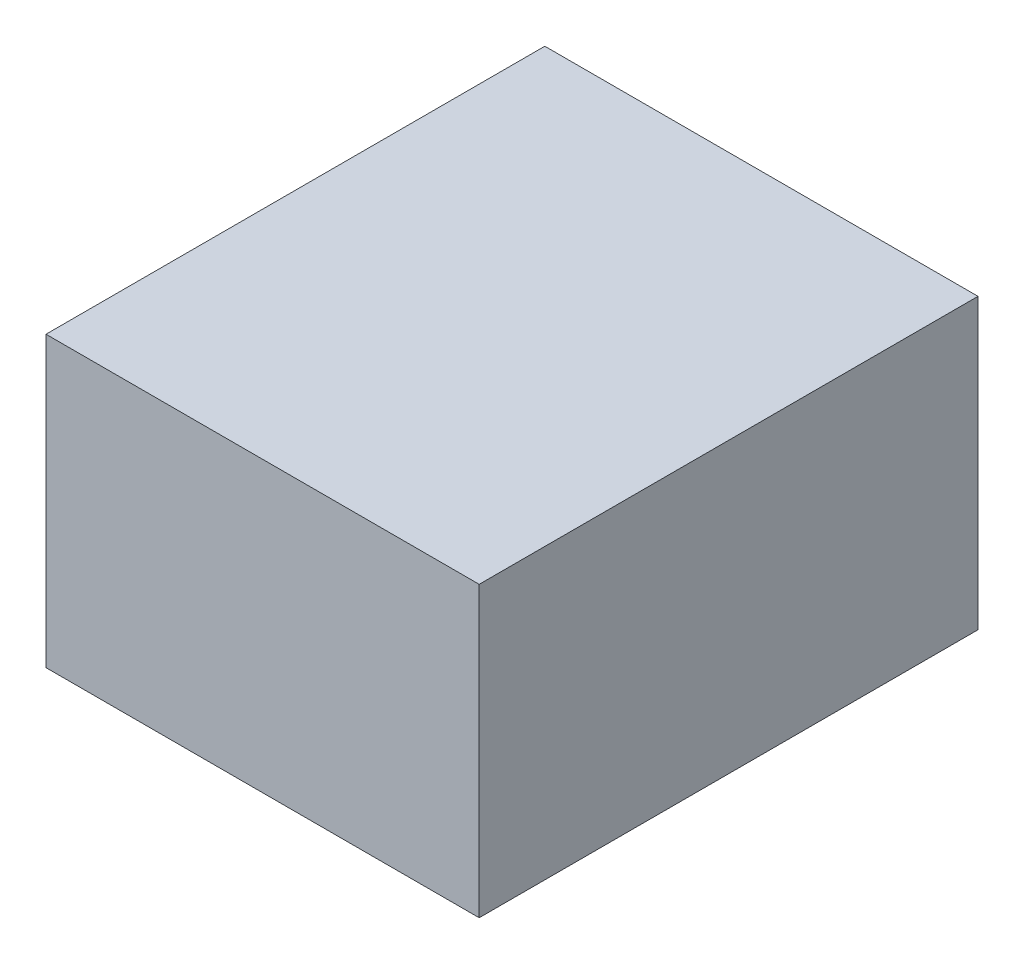
ISO-10303-21;
HEADER;
FILE_DESCRIPTION(('STEP AP214'),'2;1');
FILE_NAME('part.step','',(''),(''),'','','');
FILE_SCHEMA(('AUTOMOTIVE_DESIGN { 1 0 10303 214 1 1 1 1 }'));
ENDSEC;
DATA;
#1=APPLICATION_CONTEXT('core data for automotive mechanical design processes');
#2=APPLICATION_PROTOCOL_DEFINITION('international standard','automotive_design',2000,#1);
#3=PRODUCT_CONTEXT('',#1,'mechanical');
#4=PRODUCT('Part','Part','',(#3));
#5=PRODUCT_RELATED_PRODUCT_CATEGORY('part','',(#4));
#6=PRODUCT_DEFINITION_FORMATION('','',#4);
#7=PRODUCT_DEFINITION_CONTEXT('part definition',#1,'design');
#8=PRODUCT_DEFINITION('design','',#6,#7);
#9=PRODUCT_DEFINITION_SHAPE('','',#8);
#10=(LENGTH_UNIT() NAMED_UNIT(*) SI_UNIT(.MILLI.,.METRE.));
#11=(NAMED_UNIT(*) PLANE_ANGLE_UNIT() SI_UNIT($,.RADIAN.));
#12=(NAMED_UNIT(*) SI_UNIT($,.STERADIAN.) SOLID_ANGLE_UNIT());
#13=UNCERTAINTY_MEASURE_WITH_UNIT(LENGTH_MEASURE(1.E-05),#10,'distance_accuracy_value','');
#14=(GEOMETRIC_REPRESENTATION_CONTEXT(3) GLOBAL_UNCERTAINTY_ASSIGNED_CONTEXT((#13)) GLOBAL_UNIT_ASSIGNED_CONTEXT((#10,
#11,#12)) REPRESENTATION_CONTEXT('',''));
#15=CARTESIAN_POINT('',(0.,0.,0.));
#16=DIRECTION('',(0.,0.,1.));
#17=DIRECTION('',(1.,0.,0.));
#18=AXIS2_PLACEMENT_3D('',#15,#16,#17);
#19=CARTESIAN_POINT('',(209.55,279.4,241.3));
#20=DIRECTION('',(-1.,0.,0.));
#21=DIRECTION('',(0.,0.,1.));
#22=AXIS2_PLACEMENT_3D('',#19,#20,#21);
#23=PLANE('',#22);
#24=DIRECTION('',(0.,0.,-1.));
#25=VECTOR('',#24,1.);
#26=CARTESIAN_POINT('',(209.55,0.,241.3));
#27=LINE('',#26,#25);
#28=CARTESIAN_POINT('',(209.55,0.,241.3));
#29=VERTEX_POINT('',#28);
#30=CARTESIAN_POINT('',(209.55,0.,-241.3));
#31=VERTEX_POINT('',#30);
#32=EDGE_CURVE('E96',#29,#31,#27,.T.);
#33=ORIENTED_EDGE('',*,*,#32,.T.);
#34=DIRECTION('',(0.,-1.,0.));
#35=VECTOR('',#34,1.);
#36=CARTESIAN_POINT('',(209.55,279.4,-241.3));
#37=LINE('',#36,#35);
#38=CARTESIAN_POINT('',(209.55,279.4,-241.3));
#39=VERTEX_POINT('',#38);
#40=EDGE_CURVE('E11',#39,#31,#37,.T.);
#41=ORIENTED_EDGE('',*,*,#40,.F.);
#42=DIRECTION('',(0.,0.,-1.));
#43=VECTOR('',#42,1.);
#44=CARTESIAN_POINT('',(209.55,279.4,241.3));
#45=LINE('',#44,#43);
#46=CARTESIAN_POINT('',(209.55,279.4,241.3));
#47=VERTEX_POINT('',#46);
#48=EDGE_CURVE('E84',#47,#39,#45,.T.);
#49=ORIENTED_EDGE('',*,*,#48,.F.);
#50=DIRECTION('',(0.,-1.,0.));
#51=VECTOR('',#50,1.);
#52=CARTESIAN_POINT('',(209.55,279.4,241.3));
#53=LINE('',#52,#51);
#54=EDGE_CURVE('E92',#47,#29,#53,.T.);
#55=ORIENTED_EDGE('',*,*,#54,.T.);
#56=EDGE_LOOP('',(#33,#41,#49,#55));
#57=FACE_BOUND('',#56,.T.);
#58=ADVANCED_FACE('F33',(#57),#23,.F.);
#59=CARTESIAN_POINT('',(-209.55,279.4,-241.3));
#60=DIRECTION('',(0.,0.,1.));
#61=DIRECTION('',(1.,0.,0.));
#62=AXIS2_PLACEMENT_3D('',#59,#60,#61);
#63=PLANE('',#62);
#64=DIRECTION('',(-1.,0.,0.));
#65=VECTOR('',#64,1.);
#66=CARTESIAN_POINT('',(-209.55,0.,-241.3));
#67=LINE('',#66,#65);
#68=CARTESIAN_POINT('',(-209.55,0.,-241.3));
#69=VERTEX_POINT('',#68);
#70=EDGE_CURVE('E88',#31,#69,#67,.T.);
#71=ORIENTED_EDGE('',*,*,#70,.T.);
#72=DIRECTION('',(0.,-1.,0.));
#73=VECTOR('',#72,1.);
#74=CARTESIAN_POINT('',(-209.55,279.4,-241.3));
#75=LINE('',#74,#73);
#76=CARTESIAN_POINT('',(-209.55,279.4,-241.3));
#77=VERTEX_POINT('',#76);
#78=EDGE_CURVE('E41',#77,#69,#75,.T.);
#79=ORIENTED_EDGE('',*,*,#78,.F.);
#80=DIRECTION('',(-1.,0.,0.));
#81=VECTOR('',#80,1.);
#82=CARTESIAN_POINT('',(-209.55,279.4,-241.3));
#83=LINE('',#82,#81);
#84=EDGE_CURVE('E79',#39,#77,#83,.T.);
#85=ORIENTED_EDGE('',*,*,#84,.F.);
#86=ORIENTED_EDGE('',*,*,#40,.T.);
#87=EDGE_LOOP('',(#71,#79,#85,#86));
#88=FACE_BOUND('',#87,.T.);
#89=ADVANCED_FACE('F87',(#88),#63,.F.);
#90=CARTESIAN_POINT('',(-209.55,279.4,241.3));
#91=DIRECTION('',(1.,0.,0.));
#92=DIRECTION('',(0.,0.,-1.));
#93=AXIS2_PLACEMENT_3D('',#90,#91,#92);
#94=PLANE('',#93);
#95=DIRECTION('',(0.,0.,1.));
#96=VECTOR('',#95,1.);
#97=CARTESIAN_POINT('',(-209.55,0.,241.3));
#98=LINE('',#97,#96);
#99=CARTESIAN_POINT('',(-209.55,0.,241.3));
#100=VERTEX_POINT('',#99);
#101=EDGE_CURVE('E66',#69,#100,#98,.T.);
#102=ORIENTED_EDGE('',*,*,#101,.T.);
#103=DIRECTION('',(0.,-1.,0.));
#104=VECTOR('',#103,1.);
#105=CARTESIAN_POINT('',(-209.55,279.4,241.3));
#106=LINE('',#105,#104);
#107=CARTESIAN_POINT('',(-209.55,279.4,241.3));
#108=VERTEX_POINT('',#107);
#109=EDGE_CURVE('E89',#108,#100,#106,.T.);
#110=ORIENTED_EDGE('',*,*,#109,.F.);
#111=DIRECTION('',(0.,0.,1.));
#112=VECTOR('',#111,1.);
#113=CARTESIAN_POINT('',(-209.55,279.4,241.3));
#114=LINE('',#113,#112);
#115=EDGE_CURVE('E82',#77,#108,#114,.T.);
#116=ORIENTED_EDGE('',*,*,#115,.F.);
#117=ORIENTED_EDGE('',*,*,#78,.T.);
#118=EDGE_LOOP('',(#102,#110,#116,#117));
#119=FACE_BOUND('',#118,.T.);
#120=ADVANCED_FACE('F90',(#119),#94,.F.);
#121=CARTESIAN_POINT('',(-209.55,279.4,241.3));
#122=DIRECTION('',(0.,0.,-1.));
#123=DIRECTION('',(-1.,0.,0.));
#124=AXIS2_PLACEMENT_3D('',#121,#122,#123);
#125=PLANE('',#124);
#126=DIRECTION('',(1.,0.,0.));
#127=VECTOR('',#126,1.);
#128=CARTESIAN_POINT('',(-209.55,0.,241.3));
#129=LINE('',#128,#127);
#130=EDGE_CURVE('E72',#100,#29,#129,.T.);
#131=ORIENTED_EDGE('',*,*,#130,.T.);
#132=ORIENTED_EDGE('',*,*,#54,.F.);
#133=DIRECTION('',(1.,0.,0.));
#134=VECTOR('',#133,1.);
#135=CARTESIAN_POINT('',(-209.55,279.4,241.3));
#136=LINE('',#135,#134);
#137=EDGE_CURVE('E49',#108,#47,#136,.T.);
#138=ORIENTED_EDGE('',*,*,#137,.F.);
#139=ORIENTED_EDGE('',*,*,#109,.T.);
#140=EDGE_LOOP('',(#131,#132,#138,#139));
#141=FACE_BOUND('',#140,.T.);
#142=ADVANCED_FACE('F103',(#141),#125,.F.);
#143=CARTESIAN_POINT('',(0.,279.4,0.));
#144=DIRECTION('',(0.,-1.,0.));
#145=DIRECTION('',(0.,0.,-1.));
#146=AXIS2_PLACEMENT_3D('',#143,#144,#145);
#147=PLANE('',#146);
#148=ORIENTED_EDGE('',*,*,#48,.T.);
#149=ORIENTED_EDGE('',*,*,#84,.T.);
#150=ORIENTED_EDGE('',*,*,#115,.T.);
#151=ORIENTED_EDGE('',*,*,#137,.T.);
#152=EDGE_LOOP('',(#148,#149,#150,#151));
#153=FACE_BOUND('',#152,.T.);
#154=ADVANCED_FACE('F80',(#153),#147,.F.);
#155=CARTESIAN_POINT('',(0.,0.,0.));
#156=DIRECTION('',(0.,-1.,0.));
#157=DIRECTION('',(0.,0.,-1.));
#158=AXIS2_PLACEMENT_3D('',#155,#156,#157);
#159=PLANE('',#158);
#160=ORIENTED_EDGE('',*,*,#32,.F.);
#161=ORIENTED_EDGE('',*,*,#130,.F.);
#162=ORIENTED_EDGE('',*,*,#101,.F.);
#163=ORIENTED_EDGE('',*,*,#70,.F.);
#164=EDGE_LOOP('',(#160,#161,#162,#163));
#165=FACE_BOUND('',#164,.T.);
#166=ADVANCED_FACE('F106',(#165),#159,.T.);
#167=CLOSED_SHELL('',(#58,#89,#120,#142,#154,#166));
#168=MANIFOLD_SOLID_BREP('B2',#167);
#169=ADVANCED_BREP_SHAPE_REPRESENTATION('',(#18,#168),#14);
#170=SHAPE_DEFINITION_REPRESENTATION(#9,#169);
ENDSEC;
END-ISO-10303-21;
